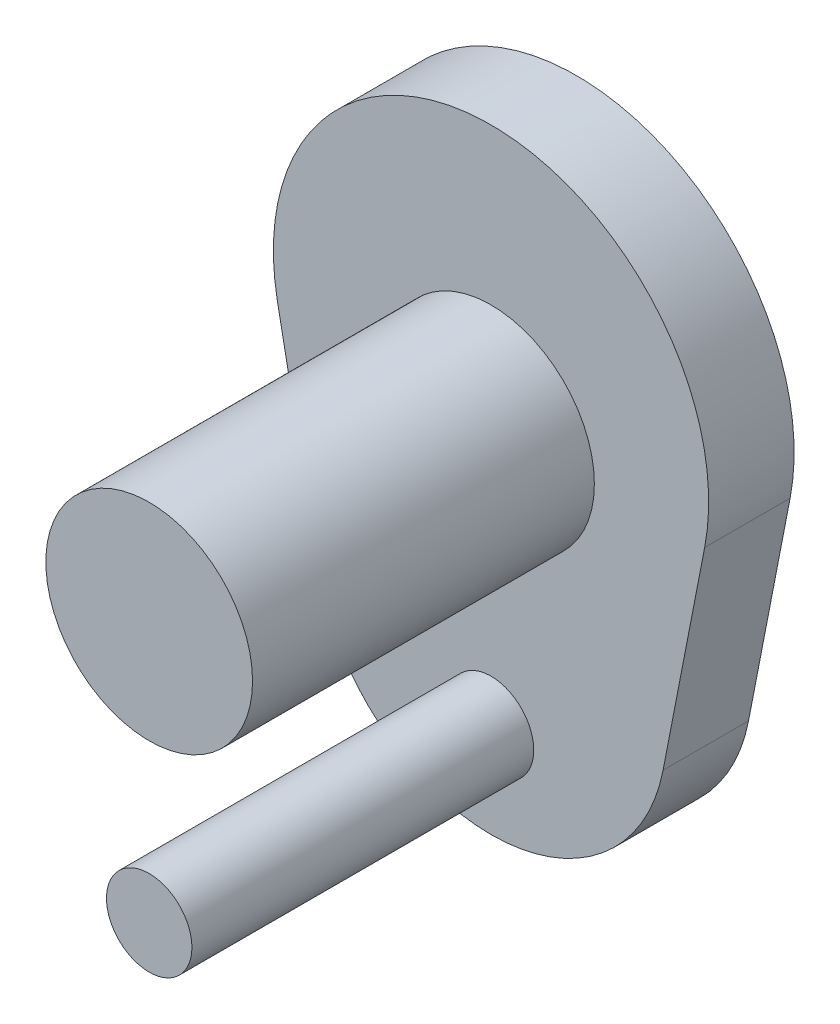
ISO-10303-21;
HEADER;
FILE_DESCRIPTION(('STEP AP214'),'2;1');
FILE_NAME('part.step','',(''),(''),'','','');
FILE_SCHEMA(('AUTOMOTIVE_DESIGN { 1 0 10303 214 1 1 1 1 }'));
ENDSEC;
DATA;
#1=APPLICATION_CONTEXT('core data for automotive mechanical design processes');
#2=APPLICATION_PROTOCOL_DEFINITION('international standard','automotive_design',2000,#1);
#3=PRODUCT_CONTEXT('',#1,'mechanical');
#4=PRODUCT('Part','Part','',(#3));
#5=PRODUCT_RELATED_PRODUCT_CATEGORY('part','',(#4));
#6=PRODUCT_DEFINITION_FORMATION('','',#4);
#7=PRODUCT_DEFINITION_CONTEXT('part definition',#1,'design');
#8=PRODUCT_DEFINITION('design','',#6,#7);
#9=PRODUCT_DEFINITION_SHAPE('','',#8);
#10=(LENGTH_UNIT() NAMED_UNIT(*) SI_UNIT(.MILLI.,.METRE.));
#11=(NAMED_UNIT(*) PLANE_ANGLE_UNIT() SI_UNIT($,.RADIAN.));
#12=(NAMED_UNIT(*) SI_UNIT($,.STERADIAN.) SOLID_ANGLE_UNIT());
#13=UNCERTAINTY_MEASURE_WITH_UNIT(LENGTH_MEASURE(1.E-05),#10,'distance_accuracy_value','');
#14=(GEOMETRIC_REPRESENTATION_CONTEXT(3) GLOBAL_UNCERTAINTY_ASSIGNED_CONTEXT((#13)) GLOBAL_UNIT_ASSIGNED_CONTEXT((#10,
#11,#12)) REPRESENTATION_CONTEXT('',''));
#15=CARTESIAN_POINT('',(0.,0.,0.));
#16=DIRECTION('',(0.,0.,1.));
#17=DIRECTION('',(1.,0.,0.));
#18=AXIS2_PLACEMENT_3D('',#15,#16,#17);
#19=CARTESIAN_POINT('',(0.,6.17986223963857,0.));
#20=DIRECTION('',(0.,0.,1.));
#21=DIRECTION('',(1.,0.,0.));
#22=AXIS2_PLACEMENT_3D('',#19,#20,#21);
#23=PLANE('',#22);
#24=CARTESIAN_POINT('',(0.,0.,0.));
#25=DIRECTION('',(0.,0.,1.));
#26=DIRECTION('',(1.,0.,0.));
#27=AXIS2_PLACEMENT_3D('',#24,#25,#26);
#28=CIRCLE('',#27,15.359074057);
#29=CARTESIAN_POINT('',(15.359074057,0.,0.));
#30=VERTEX_POINT('',#29);
#31=EDGE_CURVE('E42',#30,#30,#28,.T.);
#32=ORIENTED_EDGE('',*,*,#31,.F.);
#33=EDGE_LOOP('',(#32));
#34=FACE_BOUND('',#33,.T.);
#35=CARTESIAN_POINT('',(0.,6.17986223963857,0.));
#36=DIRECTION('',(0.,0.,-1.));
#37=DIRECTION('',(1.,0.,0.));
#38=AXIS2_PLACEMENT_3D('',#35,#36,#37);
#39=CIRCLE('',#38,32.3458374029938);
#40=CARTESIAN_POINT('',(-31.75,0.,0.));
#41=VERTEX_POINT('',#40);
#42=CARTESIAN_POINT('',(31.75,0.,0.));
#43=VERTEX_POINT('',#42);
#44=EDGE_CURVE('E101',#41,#43,#39,.T.);
#45=ORIENTED_EDGE('',*,*,#44,.F.);
#46=DIRECTION('',(-0.191055874134413,0.981579162858878,0.));
#47=VECTOR('',#46,1.);
#48=CARTESIAN_POINT('',(-31.75,0.,0.));
#49=LINE('',#48,#47);
#50=CARTESIAN_POINT('',(-25.5701377603614,-31.75,0.));
#51=VERTEX_POINT('',#50);
#52=EDGE_CURVE('E73',#51,#41,#49,.T.);
#53=ORIENTED_EDGE('',*,*,#52,.F.);
#54=CARTESIAN_POINT('',(0.,-26.7729943682641,0.));
#55=DIRECTION('',(0.,0.,-1.));
#56=DIRECTION('',(-1.,0.,0.));
#57=AXIS2_PLACEMENT_3D('',#54,#55,#56);
#58=CIRCLE('',#57,26.050000578545);
#59=CARTESIAN_POINT('',(25.5701377603614,-31.75,0.));
#60=VERTEX_POINT('',#59);
#61=EDGE_CURVE('E67',#60,#51,#58,.T.);
#62=ORIENTED_EDGE('',*,*,#61,.F.);
#63=DIRECTION('',(-0.191055874134413,-0.981579162858878,0.));
#64=VECTOR('',#63,1.);
#65=CARTESIAN_POINT('',(31.75,0.,0.));
#66=LINE('',#65,#64);
#67=EDGE_CURVE('E91',#43,#60,#66,.T.);
#68=ORIENTED_EDGE('',*,*,#67,.F.);
#69=EDGE_LOOP('',(#45,#53,#62,#68));
#70=FACE_BOUND('',#69,.T.);
#71=CARTESIAN_POINT('',(0.,-38.7776932643789,0.));
#72=DIRECTION('',(0.,0.,1.));
#73=DIRECTION('',(1.,0.,0.));
#74=AXIS2_PLACEMENT_3D('',#71,#72,#73);
#75=CIRCLE('',#74,6.35);
#76=CARTESIAN_POINT('',(6.35,-38.7776932643789,0.));
#77=VERTEX_POINT('',#76);
#78=EDGE_CURVE('E121',#77,#77,#75,.T.);
#79=ORIENTED_EDGE('',*,*,#78,.F.);
#80=EDGE_LOOP('',(#79));
#81=FACE_BOUND('',#80,.T.);
#82=ADVANCED_FACE('F33',(#34,#70,#81),#23,.T.);
#83=CARTESIAN_POINT('',(0.,0.,50.8));
#84=DIRECTION('',(0.,0.,-1.));
#85=DIRECTION('',(-1.,0.,0.));
#86=AXIS2_PLACEMENT_3D('',#83,#84,#85);
#87=CYLINDRICAL_SURFACE('',#86,15.359074057);
#88=CARTESIAN_POINT('',(0.,0.,50.8));
#89=DIRECTION('',(0.,0.,1.));
#90=DIRECTION('',(1.,0.,0.));
#91=AXIS2_PLACEMENT_3D('',#88,#89,#90);
#92=CIRCLE('',#91,15.359074057);
#93=CARTESIAN_POINT('',(15.359074057,0.,50.8));
#94=VERTEX_POINT('',#93);
#95=EDGE_CURVE('E11',#94,#94,#92,.T.);
#96=ORIENTED_EDGE('',*,*,#95,.F.);
#97=EDGE_LOOP('',(#96));
#98=FACE_BOUND('',#97,.T.);
#99=ORIENTED_EDGE('',*,*,#31,.T.);
#100=EDGE_LOOP('',(#99));
#101=FACE_BOUND('',#100,.T.);
#102=ADVANCED_FACE('F35',(#98,#101),#87,.T.);
#103=CARTESIAN_POINT('',(0.,0.,50.8));
#104=DIRECTION('',(0.,0.,1.));
#105=DIRECTION('',(1.,0.,0.));
#106=AXIS2_PLACEMENT_3D('',#103,#104,#105);
#107=PLANE('',#106);
#108=ORIENTED_EDGE('',*,*,#95,.T.);
#109=EDGE_LOOP('',(#108));
#110=FACE_BOUND('',#109,.T.);
#111=ADVANCED_FACE('F149',(#110),#107,.T.);
#112=CARTESIAN_POINT('',(0.,6.17986223963857,-12.7));
#113=DIRECTION('',(0.,0.,1.));
#114=DIRECTION('',(1.,0.,0.));
#115=AXIS2_PLACEMENT_3D('',#112,#113,#114);
#116=CYLINDRICAL_SURFACE('',#115,32.3458374029938);
#117=ORIENTED_EDGE('',*,*,#44,.T.);
#118=DIRECTION('',(0.,0.,1.));
#119=VECTOR('',#118,1.);
#120=CARTESIAN_POINT('',(31.75,0.,-12.7));
#121=LINE('',#120,#119);
#122=CARTESIAN_POINT('',(31.75,0.,-12.7));
#123=VERTEX_POINT('',#122);
#124=EDGE_CURVE('E92',#123,#43,#121,.T.);
#125=ORIENTED_EDGE('',*,*,#124,.F.);
#126=CARTESIAN_POINT('',(0.,6.17986223963857,-12.7));
#127=DIRECTION('',(0.,0.,-1.));
#128=DIRECTION('',(1.,0.,0.));
#129=AXIS2_PLACEMENT_3D('',#126,#127,#128);
#130=CIRCLE('',#129,32.3458374029938);
#131=CARTESIAN_POINT('',(-31.75,0.,-12.7));
#132=VERTEX_POINT('',#131);
#133=EDGE_CURVE('E86',#132,#123,#130,.T.);
#134=ORIENTED_EDGE('',*,*,#133,.F.);
#135=DIRECTION('',(0.,0.,1.));
#136=VECTOR('',#135,1.);
#137=CARTESIAN_POINT('',(-31.75,0.,-12.7));
#138=LINE('',#137,#136);
#139=EDGE_CURVE('E97',#132,#41,#138,.T.);
#140=ORIENTED_EDGE('',*,*,#139,.T.);
#141=EDGE_LOOP('',(#117,#125,#134,#140));
#142=FACE_BOUND('',#141,.T.);
#143=ADVANCED_FACE('F147',(#142),#116,.T.);
#144=CARTESIAN_POINT('',(31.75,0.,-12.7));
#145=DIRECTION('',(-0.981579162858878,0.191055874134413,0.));
#146=DIRECTION('',(-0.191055874134413,-0.981579162858878,0.));
#147=AXIS2_PLACEMENT_3D('',#144,#145,#146);
#148=PLANE('',#147);
#149=ORIENTED_EDGE('',*,*,#67,.T.);
#150=DIRECTION('',(0.,0.,1.));
#151=VECTOR('',#150,1.);
#152=CARTESIAN_POINT('',(25.5701377603614,-31.75,-12.7));
#153=LINE('',#152,#151);
#154=CARTESIAN_POINT('',(25.5701377603614,-31.75,-12.7));
#155=VERTEX_POINT('',#154);
#156=EDGE_CURVE('E89',#155,#60,#153,.T.);
#157=ORIENTED_EDGE('',*,*,#156,.F.);
#158=DIRECTION('',(-0.191055874134413,-0.981579162858878,0.));
#159=VECTOR('',#158,1.);
#160=CARTESIAN_POINT('',(31.75,0.,-12.7));
#161=LINE('',#160,#159);
#162=EDGE_CURVE('E81',#123,#155,#161,.T.);
#163=ORIENTED_EDGE('',*,*,#162,.F.);
#164=ORIENTED_EDGE('',*,*,#124,.T.);
#165=EDGE_LOOP('',(#149,#157,#163,#164));
#166=FACE_BOUND('',#165,.T.);
#167=ADVANCED_FACE('F90',(#166),#148,.F.);
#168=CARTESIAN_POINT('',(0.,-26.7729943682641,-12.7));
#169=DIRECTION('',(0.,0.,1.));
#170=DIRECTION('',(1.,0.,0.));
#171=AXIS2_PLACEMENT_3D('',#168,#169,#170);
#172=CYLINDRICAL_SURFACE('',#171,26.050000578545);
#173=ORIENTED_EDGE('',*,*,#61,.T.);
#174=DIRECTION('',(0.,0.,1.));
#175=VECTOR('',#174,1.);
#176=CARTESIAN_POINT('',(-25.5701377603614,-31.75,-12.7));
#177=LINE('',#176,#175);
#178=CARTESIAN_POINT('',(-25.5701377603614,-31.75,-12.7));
#179=VERTEX_POINT('',#178);
#180=EDGE_CURVE('E93',#179,#51,#177,.T.);
#181=ORIENTED_EDGE('',*,*,#180,.F.);
#182=CARTESIAN_POINT('',(0.,-26.7729943682641,-12.7));
#183=DIRECTION('',(0.,0.,-1.));
#184=DIRECTION('',(-1.,0.,0.));
#185=AXIS2_PLACEMENT_3D('',#182,#183,#184);
#186=CIRCLE('',#185,26.050000578545);
#187=EDGE_CURVE('E84',#155,#179,#186,.T.);
#188=ORIENTED_EDGE('',*,*,#187,.F.);
#189=ORIENTED_EDGE('',*,*,#156,.T.);
#190=EDGE_LOOP('',(#173,#181,#188,#189));
#191=FACE_BOUND('',#190,.T.);
#192=ADVANCED_FACE('F95',(#191),#172,.T.);
#193=CARTESIAN_POINT('',(-31.75,0.,-12.7));
#194=DIRECTION('',(0.981579162858878,0.191055874134413,0.));
#195=DIRECTION('',(-0.191055874134413,0.981579162858878,0.));
#196=AXIS2_PLACEMENT_3D('',#193,#194,#195);
#197=PLANE('',#196);
#198=ORIENTED_EDGE('',*,*,#52,.T.);
#199=ORIENTED_EDGE('',*,*,#139,.F.);
#200=DIRECTION('',(-0.191055874134413,0.981579162858878,0.));
#201=VECTOR('',#200,1.);
#202=CARTESIAN_POINT('',(-31.75,0.,-12.7));
#203=LINE('',#202,#201);
#204=EDGE_CURVE('E50',#179,#132,#203,.T.);
#205=ORIENTED_EDGE('',*,*,#204,.F.);
#206=ORIENTED_EDGE('',*,*,#180,.T.);
#207=EDGE_LOOP('',(#198,#199,#205,#206));
#208=FACE_BOUND('',#207,.T.);
#209=ADVANCED_FACE('F138',(#208),#197,.F.);
#210=CARTESIAN_POINT('',(0.,6.17986223963857,-12.7));
#211=DIRECTION('',(0.,0.,1.));
#212=DIRECTION('',(1.,0.,0.));
#213=AXIS2_PLACEMENT_3D('',#210,#211,#212);
#214=PLANE('',#213);
#215=ORIENTED_EDGE('',*,*,#133,.T.);
#216=ORIENTED_EDGE('',*,*,#162,.T.);
#217=ORIENTED_EDGE('',*,*,#187,.T.);
#218=ORIENTED_EDGE('',*,*,#204,.T.);
#219=EDGE_LOOP('',(#215,#216,#217,#218));
#220=FACE_BOUND('',#219,.T.);
#221=ADVANCED_FACE('F82',(#220),#214,.F.);
#222=CARTESIAN_POINT('',(0.,-38.7776932643789,50.8));
#223=DIRECTION('',(0.,0.,-1.));
#224=DIRECTION('',(-1.,0.,0.));
#225=AXIS2_PLACEMENT_3D('',#222,#223,#224);
#226=CYLINDRICAL_SURFACE('',#225,6.35);
#227=CARTESIAN_POINT('',(0.,-38.7776932643789,50.8));
#228=DIRECTION('',(0.,0.,1.));
#229=DIRECTION('',(1.,0.,0.));
#230=AXIS2_PLACEMENT_3D('',#227,#228,#229);
#231=CIRCLE('',#230,6.35);
#232=CARTESIAN_POINT('',(6.35,-38.7776932643789,50.8));
#233=VERTEX_POINT('',#232);
#234=EDGE_CURVE('E104',#233,#233,#231,.T.);
#235=ORIENTED_EDGE('',*,*,#234,.F.);
#236=EDGE_LOOP('',(#235));
#237=FACE_BOUND('',#236,.T.);
#238=ORIENTED_EDGE('',*,*,#78,.T.);
#239=EDGE_LOOP('',(#238));
#240=FACE_BOUND('',#239,.T.);
#241=ADVANCED_FACE('F130',(#237,#240),#226,.T.);
#242=CARTESIAN_POINT('',(0.,-38.7776932643789,50.8));
#243=DIRECTION('',(0.,0.,1.));
#244=DIRECTION('',(1.,0.,0.));
#245=AXIS2_PLACEMENT_3D('',#242,#243,#244);
#246=PLANE('',#245);
#247=ORIENTED_EDGE('',*,*,#234,.T.);
#248=EDGE_LOOP('',(#247));
#249=FACE_BOUND('',#248,.T.);
#250=ADVANCED_FACE('F128',(#249),#246,.T.);
#251=CLOSED_SHELL('',(#82,#102,#111,#143,#167,#192,#209,#221,#241,#250));
#252=MANIFOLD_SOLID_BREP('B2',#251);
#253=ADVANCED_BREP_SHAPE_REPRESENTATION('',(#18,#252),#14);
#254=SHAPE_DEFINITION_REPRESENTATION(#9,#253);
ENDSEC;
END-ISO-10303-21;
